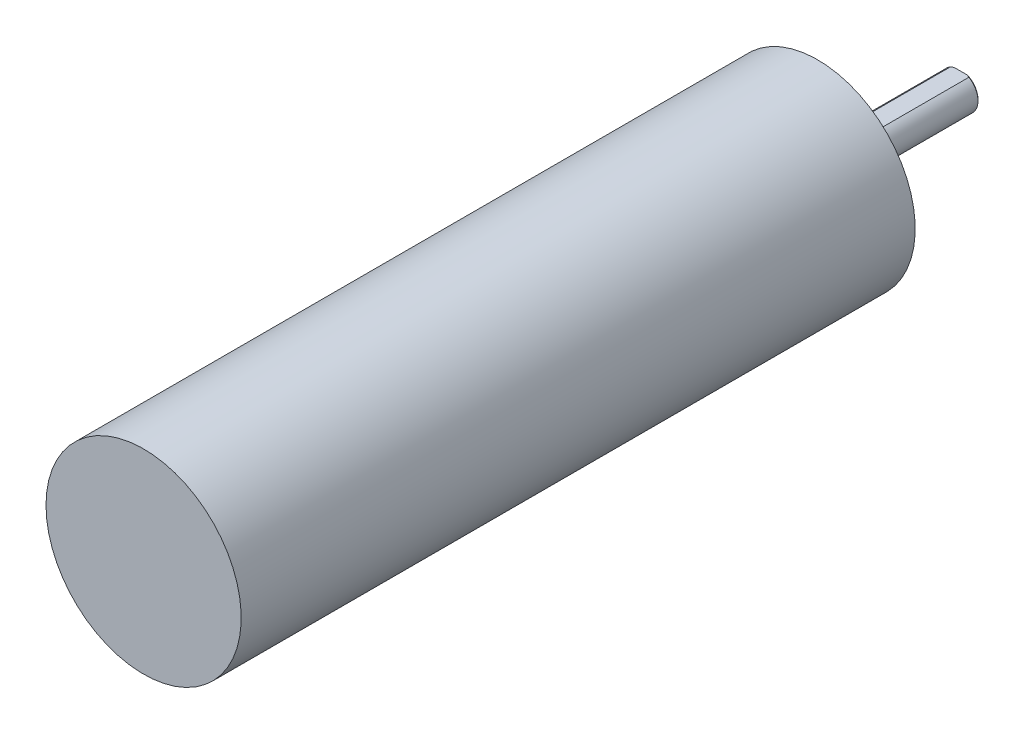
ISO-10303-21;
HEADER;
FILE_DESCRIPTION(('STEP AP214'),'2;1');
FILE_NAME('part.step','',(''),(''),'','','');
FILE_SCHEMA(('AUTOMOTIVE_DESIGN { 1 0 10303 214 1 1 1 1 }'));
ENDSEC;
DATA;
#1=APPLICATION_CONTEXT('core data for automotive mechanical design processes');
#2=APPLICATION_PROTOCOL_DEFINITION('international standard','automotive_design',2000,#1);
#3=PRODUCT_CONTEXT('',#1,'mechanical');
#4=PRODUCT('Part','Part','',(#3));
#5=PRODUCT_RELATED_PRODUCT_CATEGORY('part','',(#4));
#6=PRODUCT_DEFINITION_FORMATION('','',#4);
#7=PRODUCT_DEFINITION_CONTEXT('part definition',#1,'design');
#8=PRODUCT_DEFINITION('design','',#6,#7);
#9=PRODUCT_DEFINITION_SHAPE('','',#8);
#10=(LENGTH_UNIT() NAMED_UNIT(*) SI_UNIT(.MILLI.,.METRE.));
#11=(NAMED_UNIT(*) PLANE_ANGLE_UNIT() SI_UNIT($,.RADIAN.));
#12=(NAMED_UNIT(*) SI_UNIT($,.STERADIAN.) SOLID_ANGLE_UNIT());
#13=UNCERTAINTY_MEASURE_WITH_UNIT(LENGTH_MEASURE(1.E-05),#10,'distance_accuracy_value','');
#14=(GEOMETRIC_REPRESENTATION_CONTEXT(3) GLOBAL_UNCERTAINTY_ASSIGNED_CONTEXT((#13)) GLOBAL_UNIT_ASSIGNED_CONTEXT((#10,
#11,#12)) REPRESENTATION_CONTEXT('',''));
#15=CARTESIAN_POINT('',(0.,0.,0.));
#16=DIRECTION('',(0.,0.,1.));
#17=DIRECTION('',(1.,0.,0.));
#18=AXIS2_PLACEMENT_3D('',#15,#16,#17);
#19=CARTESIAN_POINT('',(0.,0.,-2.6));
#20=DIRECTION('',(0.,0.,-1.));
#21=DIRECTION('',(-1.,0.,0.));
#22=AXIS2_PLACEMENT_3D('',#19,#20,#21);
#23=PLANE('',#22);
#24=CARTESIAN_POINT('',(0.,0.,-2.6));
#25=DIRECTION('',(0.,0.,-1.));
#26=DIRECTION('',(-1.,0.,0.));
#27=AXIS2_PLACEMENT_3D('',#24,#25,#26);
#28=CIRCLE('',#27,2.75);
#29=CARTESIAN_POINT('',(-2.75,0.,-2.6));
#30=VERTEX_POINT('',#29);
#31=EDGE_CURVE('E110',#30,#30,#28,.T.);
#32=ORIENTED_EDGE('',*,*,#31,.T.);
#33=EDGE_LOOP('',(#32));
#34=FACE_BOUND('',#33,.T.);
#35=CARTESIAN_POINT('',(0.,0.,-2.6));
#36=DIRECTION('',(0.,0.,-1.));
#37=DIRECTION('',(-1.,0.,0.));
#38=AXIS2_PLACEMENT_3D('',#35,#36,#37);
#39=CIRCLE('',#38,1.5);
#40=CARTESIAN_POINT('',(-1.5,0.,-2.6));
#41=VERTEX_POINT('',#40);
#42=EDGE_CURVE('E88',#41,#41,#39,.T.);
#43=ORIENTED_EDGE('',*,*,#42,.F.);
#44=EDGE_LOOP('',(#43));
#45=FACE_BOUND('',#44,.T.);
#46=ADVANCED_FACE('F38',(#34,#45),#23,.T.);
#47=CARTESIAN_POINT('',(0.,0.,-1.));
#48=DIRECTION('',(0.,0.,-1.));
#49=DIRECTION('',(-1.,0.,0.));
#50=AXIS2_PLACEMENT_3D('',#47,#48,#49);
#51=PLANE('',#50);
#52=CARTESIAN_POINT('',(0.,0.,-1.));
#53=DIRECTION('',(0.,0.,-1.));
#54=DIRECTION('',(-1.,0.,0.));
#55=AXIS2_PLACEMENT_3D('',#52,#53,#54);
#56=CIRCLE('',#55,3.);
#57=CARTESIAN_POINT('',(-3.,0.,-1.));
#58=VERTEX_POINT('',#57);
#59=EDGE_CURVE('E113',#58,#58,#56,.T.);
#60=ORIENTED_EDGE('',*,*,#59,.T.);
#61=EDGE_LOOP('',(#60));
#62=FACE_BOUND('',#61,.T.);
#63=CARTESIAN_POINT('',(0.,0.,-1.));
#64=DIRECTION('',(0.,0.,-1.));
#65=DIRECTION('',(-1.,0.,0.));
#66=AXIS2_PLACEMENT_3D('',#63,#64,#65);
#67=CIRCLE('',#66,2.75);
#68=CARTESIAN_POINT('',(-2.75,0.,-1.));
#69=VERTEX_POINT('',#68);
#70=EDGE_CURVE('E114',#69,#69,#67,.T.);
#71=ORIENTED_EDGE('',*,*,#70,.F.);
#72=EDGE_LOOP('',(#71));
#73=FACE_BOUND('',#72,.T.);
#74=ADVANCED_FACE('F167',(#62,#73),#51,.T.);
#75=CARTESIAN_POINT('',(0.,0.,-1.));
#76=DIRECTION('',(0.,0.,1.));
#77=DIRECTION('',(1.,0.,0.));
#78=AXIS2_PLACEMENT_3D('',#75,#76,#77);
#79=CYLINDRICAL_SURFACE('',#78,3.);
#80=CARTESIAN_POINT('',(0.,0.,-0.05));
#81=DIRECTION('',(0.,0.,-1.));
#82=DIRECTION('',(-1.,0.,0.));
#83=AXIS2_PLACEMENT_3D('',#80,#81,#82);
#84=CIRCLE('',#83,3.);
#85=CARTESIAN_POINT('',(-3.,0.,-0.05));
#86=VERTEX_POINT('',#85);
#87=EDGE_CURVE('E109',#86,#86,#84,.T.);
#88=ORIENTED_EDGE('',*,*,#87,.T.);
#89=EDGE_LOOP('',(#88));
#90=FACE_BOUND('',#89,.T.);
#91=ORIENTED_EDGE('',*,*,#59,.F.);
#92=EDGE_LOOP('',(#91));
#93=FACE_BOUND('',#92,.T.);
#94=ADVANCED_FACE('F173',(#90,#93),#79,.T.);
#95=CARTESIAN_POINT('',(0.,0.,-2.6));
#96=DIRECTION('',(0.,0.,1.));
#97=DIRECTION('',(1.,0.,0.));
#98=AXIS2_PLACEMENT_3D('',#95,#96,#97);
#99=CYLINDRICAL_SURFACE('',#98,2.75);
#100=ORIENTED_EDGE('',*,*,#31,.F.);
#101=EDGE_LOOP('',(#100));
#102=FACE_BOUND('',#101,.T.);
#103=ORIENTED_EDGE('',*,*,#70,.T.);
#104=EDGE_LOOP('',(#103));
#105=FACE_BOUND('',#104,.T.);
#106=ADVANCED_FACE('F179',(#102,#105),#99,.T.);
#107=CARTESIAN_POINT('',(0.,0.,-11.8));
#108=DIRECTION('',(0.,0.,-1.));
#109=DIRECTION('',(-1.,0.,0.));
#110=AXIS2_PLACEMENT_3D('',#107,#108,#109);
#111=PLANE('',#110);
#112=DIRECTION('',(1.,0.,0.));
#113=VECTOR('',#112,1.);
#114=CARTESIAN_POINT('',(0.748331477354788,1.3,-11.8));
#115=LINE('',#114,#113);
#116=CARTESIAN_POINT('',(-0.519615242270696,1.3,-11.8));
#117=VERTEX_POINT('',#116);
#118=CARTESIAN_POINT('',(0.519615242270697,1.3,-11.8));
#119=VERTEX_POINT('',#118);
#120=EDGE_CURVE('E119',#117,#119,#115,.T.);
#121=ORIENTED_EDGE('',*,*,#120,.T.);
#122=CARTESIAN_POINT('',(0.,0.,-11.8));
#123=DIRECTION('',(0.,0.,-1.));
#124=DIRECTION('',(-1.,0.,0.));
#125=AXIS2_PLACEMENT_3D('',#122,#123,#124);
#126=CIRCLE('',#125,1.40000000000001);
#127=EDGE_CURVE('E87',#119,#117,#126,.T.);
#128=ORIENTED_EDGE('',*,*,#127,.T.);
#129=EDGE_LOOP('',(#121,#128));
#130=FACE_BOUND('',#129,.T.);
#131=ADVANCED_FACE('F146',(#130),#111,.T.);
#132=CARTESIAN_POINT('',(0.,0.,-11.8));
#133=DIRECTION('',(0.,0.,1.));
#134=DIRECTION('',(1.,0.,0.));
#135=AXIS2_PLACEMENT_3D('',#132,#133,#134);
#136=CYLINDRICAL_SURFACE('',#135,1.5);
#137=DIRECTION('',(0.,0.,1.));
#138=VECTOR('',#137,1.);
#139=CARTESIAN_POINT('',(-0.748331477354788,1.3,-11.8));
#140=LINE('',#139,#138);
#141=CARTESIAN_POINT('',(-0.748331477354788,1.3,-11.7));
#142=VERTEX_POINT('',#141);
#143=CARTESIAN_POINT('',(-0.748331477354789,1.3,-4.));
#144=VERTEX_POINT('',#143);
#145=EDGE_CURVE('E75',#142,#144,#140,.T.);
#146=ORIENTED_EDGE('',*,*,#145,.F.);
#147=CARTESIAN_POINT('',(0.,0.,-11.7));
#148=DIRECTION('',(0.,0.,-1.));
#149=DIRECTION('',(-1.,0.,0.));
#150=AXIS2_PLACEMENT_3D('',#147,#148,#149);
#151=CIRCLE('',#150,1.5);
#152=CARTESIAN_POINT('',(0.748331477354788,1.3,-11.7));
#153=VERTEX_POINT('',#152);
#154=EDGE_CURVE('E11',#142,#153,#151,.F.);
#155=ORIENTED_EDGE('',*,*,#154,.T.);
#156=DIRECTION('',(0.,0.,1.));
#157=VECTOR('',#156,1.);
#158=CARTESIAN_POINT('',(0.748331477354788,1.3,-11.8));
#159=LINE('',#158,#157);
#160=CARTESIAN_POINT('',(0.748331477354788,1.3,-4.));
#161=VERTEX_POINT('',#160);
#162=EDGE_CURVE('E81',#153,#161,#159,.T.);
#163=ORIENTED_EDGE('',*,*,#162,.T.);
#164=CARTESIAN_POINT('',(0.,0.,-4.));
#165=DIRECTION('',(0.,0.,-1.));
#166=DIRECTION('',(-1.,0.,0.));
#167=AXIS2_PLACEMENT_3D('',#164,#165,#166);
#168=CIRCLE('',#167,1.5);
#169=EDGE_CURVE('E86',#144,#161,#168,.T.);
#170=ORIENTED_EDGE('',*,*,#169,.F.);
#171=EDGE_LOOP('',(#146,#155,#163,#170));
#172=FACE_BOUND('',#171,.T.);
#173=ORIENTED_EDGE('',*,*,#42,.T.);
#174=EDGE_LOOP('',(#173));
#175=FACE_BOUND('',#174,.T.);
#176=ADVANCED_FACE('F90',(#172,#175),#136,.T.);
#177=CARTESIAN_POINT('',(0.748331477354788,1.3,-11.8));
#178=DIRECTION('',(0.,-1.,0.));
#179=DIRECTION('',(0.,0.,-1.));
#180=AXIS2_PLACEMENT_3D('',#177,#178,#179);
#181=PLANE('',#180);
#182=ORIENTED_EDGE('',*,*,#120,.F.);
#183=CARTESIAN_POINT('',(-0.519615242270697,1.3,-11.8));
#184=CARTESIAN_POINT('',(-0.539135120234035,1.3,-11.7927547242475));
#185=CARTESIAN_POINT('',(-0.558538916494121,1.3,-11.7852013244943));
#186=CARTESIAN_POINT('',(-0.597104377344718,1.3,-11.7695374537162));
#187=CARTESIAN_POINT('',(-0.616266205801922,1.3,-11.7614273866137));
#188=CARTESIAN_POINT('',(-0.654364246463544,1.3,-11.7446994741088));
#189=CARTESIAN_POINT('',(-0.67330047677134,1.3,-11.736081669785));
#190=CARTESIAN_POINT('',(-0.710969948637626,1.3,-11.7183785480483));
#191=CARTESIAN_POINT('',(-0.729703034579311,1.3,-11.7092928991887));
#192=CARTESIAN_POINT('',(-0.748331477354788,1.3,-11.7));
#193=B_SPLINE_CURVE_WITH_KNOTS('',3,(#183,#184,#185,#186,#187,#188,#189,#190,#191,#192),
.UNSPECIFIED.,.F.,.F.,(4,2,2,2,4),(0.,0.0624584960327279,0.124872141246711,0.187280743806981,
0.249734185241813),.UNSPECIFIED.);
#194=EDGE_CURVE('E47',#117,#142,#193,.T.);
#195=ORIENTED_EDGE('',*,*,#194,.T.);
#196=ORIENTED_EDGE('',*,*,#145,.T.);
#197=DIRECTION('',(1.,0.,0.));
#198=VECTOR('',#197,1.);
#199=CARTESIAN_POINT('',(0.748331477354788,1.3,-4.));
#200=LINE('',#199,#198);
#201=EDGE_CURVE('E78',#144,#161,#200,.T.);
#202=ORIENTED_EDGE('',*,*,#201,.T.);
#203=ORIENTED_EDGE('',*,*,#162,.F.);
#204=CARTESIAN_POINT('',(0.748331477354788,1.3,-11.7));
#205=CARTESIAN_POINT('',(0.729703034579311,1.3,-11.7092928991887));
#206=CARTESIAN_POINT('',(0.710969948637627,1.3,-11.7183785480483));
#207=CARTESIAN_POINT('',(0.673300476771341,1.3,-11.736081669785));
#208=CARTESIAN_POINT('',(0.654364246463545,1.3,-11.7446994741088));
#209=CARTESIAN_POINT('',(0.616266205801922,1.3,-11.7614273866137));
#210=CARTESIAN_POINT('',(0.597104377344718,1.3,-11.7695374537162));
#211=CARTESIAN_POINT('',(0.558538916494121,1.3,-11.7852013244943));
#212=CARTESIAN_POINT('',(0.539135120234035,1.3,-11.7927547242475));
#213=CARTESIAN_POINT('',(0.519615242270697,1.3,-11.8));
#214=B_SPLINE_CURVE_WITH_KNOTS('',3,(#204,#205,#206,#207,#208,#209,#210,#211,#212,#213),
.UNSPECIFIED.,.F.,.F.,(4,2,2,2,4),(0.,0.0624534414348304,0.124862043995102,0.187275689209085,
0.249734185241813),.UNSPECIFIED.);
#215=EDGE_CURVE('E131',#153,#119,#214,.T.);
#216=ORIENTED_EDGE('',*,*,#215,.T.);
#217=EDGE_LOOP('',(#182,#195,#196,#202,#203,#216));
#218=FACE_BOUND('',#217,.T.);
#219=ADVANCED_FACE('F77',(#218),#181,.F.);
#220=CARTESIAN_POINT('',(0.,0.,-0.05));
#221=DIRECTION('',(0.,0.,-1.));
#222=DIRECTION('',(-1.,0.,0.));
#223=AXIS2_PLACEMENT_3D('',#220,#221,#222);
#224=PLANE('',#223);
#225=CARTESIAN_POINT('',(5.5,0.,-0.0500000000000001));
#226=DIRECTION('',(0.,0.,-1.));
#227=DIRECTION('',(-1.,0.,0.));
#228=AXIS2_PLACEMENT_3D('',#225,#226,#227);
#229=CIRCLE('',#228,0.799999999999999);
#230=CARTESIAN_POINT('',(4.7,0.,-0.0500000000000001));
#231=VERTEX_POINT('',#230);
#232=EDGE_CURVE('E92',#231,#231,#229,.T.);
#233=ORIENTED_EDGE('',*,*,#232,.F.);
#234=EDGE_LOOP('',(#233));
#235=FACE_BOUND('',#234,.T.);
#236=CARTESIAN_POINT('',(-5.5,0.,-0.0500000000000001));
#237=DIRECTION('',(0.,0.,-1.));
#238=DIRECTION('',(-1.,0.,0.));
#239=AXIS2_PLACEMENT_3D('',#236,#237,#238);
#240=CIRCLE('',#239,0.799999999999999);
#241=CARTESIAN_POINT('',(-6.3,0.,-0.0500000000000001));
#242=VERTEX_POINT('',#241);
#243=EDGE_CURVE('E100',#242,#242,#240,.T.);
#244=ORIENTED_EDGE('',*,*,#243,.F.);
#245=EDGE_LOOP('',(#244));
#246=FACE_BOUND('',#245,.T.);
#247=CARTESIAN_POINT('',(0.,0.,-0.05));
#248=DIRECTION('',(0.,0.,-1.));
#249=DIRECTION('',(-1.,0.,0.));
#250=AXIS2_PLACEMENT_3D('',#247,#248,#249);
#251=CIRCLE('',#250,8.);
#252=CARTESIAN_POINT('',(-8.,0.,-0.0499999999999945));
#253=VERTEX_POINT('',#252);
#254=EDGE_CURVE('E106',#253,#253,#251,.T.);
#255=ORIENTED_EDGE('',*,*,#254,.T.);
#256=EDGE_LOOP('',(#255));
#257=FACE_BOUND('',#256,.T.);
#258=ORIENTED_EDGE('',*,*,#87,.F.);
#259=EDGE_LOOP('',(#258));
#260=FACE_BOUND('',#259,.T.);
#261=ADVANCED_FACE('F145',(#235,#246,#257,#260),#224,.T.);
#262=CARTESIAN_POINT('',(0.,0.,55.2));
#263=DIRECTION('',(0.,0.,1.));
#264=DIRECTION('',(1.,0.,0.));
#265=AXIS2_PLACEMENT_3D('',#262,#263,#264);
#266=PLANE('',#265);
#267=CARTESIAN_POINT('',(0.,0.,55.2));
#268=DIRECTION('',(0.,0.,1.));
#269=DIRECTION('',(1.,0.,0.));
#270=AXIS2_PLACEMENT_3D('',#267,#268,#269);
#271=CIRCLE('',#270,8.);
#272=CARTESIAN_POINT('',(-8.,0.,55.2));
#273=VERTEX_POINT('',#272);
#274=EDGE_CURVE('E80',#273,#273,#271,.T.);
#275=ORIENTED_EDGE('',*,*,#274,.T.);
#276=EDGE_LOOP('',(#275));
#277=FACE_BOUND('',#276,.T.);
#278=ADVANCED_FACE('F151',(#277),#266,.T.);
#279=CARTESIAN_POINT('',(0.,0.,55.2));
#280=DIRECTION('',(0.,0.,-1.));
#281=DIRECTION('',(-1.,0.,0.));
#282=AXIS2_PLACEMENT_3D('',#279,#280,#281);
#283=CYLINDRICAL_SURFACE('',#282,8.);
#284=CARTESIAN_POINT('',(-8.,0.,55.2));
#285=CARTESIAN_POINT('',(-8.,0.,54.6244791666667));
#286=CARTESIAN_POINT('',(-8.,0.,54.0489583333333));
#287=CARTESIAN_POINT('',(-8.,0.,52.8979166666667));
#288=CARTESIAN_POINT('',(-8.,0.,52.3223958333333));
#289=CARTESIAN_POINT('',(-8.,0.,51.1713541666667));
#290=CARTESIAN_POINT('',(-8.,0.,50.5958333333333));
#291=CARTESIAN_POINT('',(-8.,0.,49.4447916666667));
#292=CARTESIAN_POINT('',(-8.,0.,48.8692708333333));
#293=CARTESIAN_POINT('',(-8.,0.,47.7182291666667));
#294=CARTESIAN_POINT('',(-8.,0.,47.1427083333333));
#295=CARTESIAN_POINT('',(-8.,0.,45.9916666666667));
#296=CARTESIAN_POINT('',(-8.,0.,45.4161458333333));
#297=CARTESIAN_POINT('',(-8.,0.,44.2651041666667));
#298=CARTESIAN_POINT('',(-8.,0.,43.6895833333333));
#299=CARTESIAN_POINT('',(-8.,0.,42.5385416666667));
#300=CARTESIAN_POINT('',(-8.,0.,41.9630208333333));
#301=CARTESIAN_POINT('',(-8.,0.,40.8119791666667));
#302=CARTESIAN_POINT('',(-8.,0.,40.2364583333333));
#303=CARTESIAN_POINT('',(-8.,0.,39.0854166666667));
#304=CARTESIAN_POINT('',(-8.,0.,38.5098958333333));
#305=CARTESIAN_POINT('',(-8.,0.,37.3588541666667));
#306=CARTESIAN_POINT('',(-8.,0.,36.7833333333333));
#307=CARTESIAN_POINT('',(-8.,0.,35.6322916666667));
#308=CARTESIAN_POINT('',(-8.,0.,35.0567708333333));
#309=CARTESIAN_POINT('',(-8.,0.,33.9057291666667));
#310=CARTESIAN_POINT('',(-8.,0.,33.3302083333333));
#311=CARTESIAN_POINT('',(-8.,0.,32.1791666666667));
#312=CARTESIAN_POINT('',(-8.,0.,31.6036458333333));
#313=CARTESIAN_POINT('',(-8.,0.,30.4526041666667));
#314=CARTESIAN_POINT('',(-8.,0.,29.8770833333333));
#315=CARTESIAN_POINT('',(-8.,0.,28.7260416666667));
#316=CARTESIAN_POINT('',(-8.,0.,28.1505208333333));
#317=CARTESIAN_POINT('',(-8.,0.,26.9994791666667));
#318=CARTESIAN_POINT('',(-8.,0.,26.4239583333333));
#319=CARTESIAN_POINT('',(-8.,0.,25.2729166666667));
#320=CARTESIAN_POINT('',(-8.,0.,24.6973958333333));
#321=CARTESIAN_POINT('',(-8.,0.,23.5463541666667));
#322=CARTESIAN_POINT('',(-8.,0.,22.9708333333333));
#323=CARTESIAN_POINT('',(-8.,0.,21.8197916666667));
#324=CARTESIAN_POINT('',(-8.,0.,21.2442708333333));
#325=CARTESIAN_POINT('',(-8.,0.,20.0932291666667));
#326=CARTESIAN_POINT('',(-8.,0.,19.5177083333333));
#327=CARTESIAN_POINT('',(-8.,0.,18.3666666666667));
#328=CARTESIAN_POINT('',(-8.,0.,17.7911458333333));
#329=CARTESIAN_POINT('',(-8.,0.,16.6401041666667));
#330=CARTESIAN_POINT('',(-8.,0.,16.0645833333333));
#331=CARTESIAN_POINT('',(-8.,0.,14.9135416666667));
#332=CARTESIAN_POINT('',(-8.,0.,14.3380208333333));
#333=CARTESIAN_POINT('',(-8.,0.,13.1869791666667));
#334=CARTESIAN_POINT('',(-8.,0.,12.6114583333333));
#335=CARTESIAN_POINT('',(-8.,0.,11.4604166666667));
#336=CARTESIAN_POINT('',(-8.,0.,10.8848958333333));
#337=CARTESIAN_POINT('',(-8.,0.,9.73385416666667));
#338=CARTESIAN_POINT('',(-8.,0.,9.15833333333334));
#339=CARTESIAN_POINT('',(-8.,0.,8.00729166666667));
#340=CARTESIAN_POINT('',(-8.,0.,7.43177083333334));
#341=CARTESIAN_POINT('',(-8.,0.,6.28072916666667));
#342=CARTESIAN_POINT('',(-8.,0.,5.70520833333334));
#343=CARTESIAN_POINT('',(-8.,0.,4.55416666666667));
#344=CARTESIAN_POINT('',(-8.,0.,3.97864583333334));
#345=CARTESIAN_POINT('',(-8.,0.,2.82760416666667));
#346=CARTESIAN_POINT('',(-8.,0.,2.25208333333334));
#347=CARTESIAN_POINT('',(-8.,0.,1.10104166666667));
#348=CARTESIAN_POINT('',(-8.,0.,0.52552083333334));
#349=CARTESIAN_POINT('',(-8.,0.,-0.0499999999999945));
#350=B_SPLINE_CURVE_WITH_KNOTS('',3,(#284,#285,#286,#287,#288,#289,#290,#291,#292,#293,#294,
#295,#296,#297,#298,#299,#300,#301,#302,#303,#304,#305,#306,#307,#308,#309,#310,#311,#312,#313,
#314,#315,#316,#317,#318,#319,#320,#321,#322,#323,#324,#325,#326,#327,#328,#329,#330,#331,#332,
#333,#334,#335,#336,#337,#338,#339,#340,#341,#342,#343,#344,#345,#346,#347,#348,#349),
.UNSPECIFIED.,.F.,.F.,(4,2,2,2,2,2,2,2,2,2,2,2,2,2,2,2,2,2,2,2,2,2,2,2,2,2,2,2,2,2,2,2,4),(0.,
1.72656249999999,3.45312499999999,5.17968749999999,6.90625,8.6328125,10.359375,12.0859375,
13.8125,15.5390625,17.265625,18.9921875,20.71875,22.4453125,24.171875,25.8984375,27.625,
29.3515625,31.078125,32.8046875,34.53125,36.2578125,37.984375,39.7109375,41.4375,43.1640625,
44.890625,46.6171875,48.34375,50.0703125,51.796875,53.5234375,55.25),.UNSPECIFIED.);
#351=EDGE_CURVE('BSEAM153',#273,#253,#350,.T.);
#352=ORIENTED_EDGE('',*,*,#274,.F.);
#353=ORIENTED_EDGE('',*,*,#254,.F.);
#354=ORIENTED_EDGE('',*,*,#351,.T.);
#355=ORIENTED_EDGE('',*,*,#351,.F.);
#356=EDGE_LOOP('',(#352,#354,#353,#355));
#357=FACE_BOUND('',#356,.T.);
#358=ADVANCED_FACE('F153',(#357),#283,.T.);
#359=CARTESIAN_POINT('',(-5.5,0.,5.15));
#360=DIRECTION('',(0.,0.,-1.));
#361=DIRECTION('',(-1.,0.,0.));
#362=AXIS2_PLACEMENT_3D('',#359,#360,#361);
#363=CONICAL_SURFACE('',#362,0.799999999999999,1.02974425867665);
#364=CARTESIAN_POINT('',(-5.5,0.,5.63068849522205));
#365=VERTEX_POINT('',#364);
#366=VERTEX_LOOP('',#365);
#367=FACE_BOUND('',#366,.T.);
#368=CARTESIAN_POINT('',(-5.5,0.,5.15));
#369=DIRECTION('',(0.,0.,-1.));
#370=DIRECTION('',(-1.,0.,0.));
#371=AXIS2_PLACEMENT_3D('',#368,#369,#370);
#372=CIRCLE('',#371,0.799999999999999);
#373=CARTESIAN_POINT('',(-6.3,0.,5.15));
#374=VERTEX_POINT('',#373);
#375=EDGE_CURVE('E103',#374,#374,#372,.T.);
#376=ORIENTED_EDGE('',*,*,#375,.T.);
#377=EDGE_LOOP('',(#376));
#378=FACE_BOUND('',#377,.T.);
#379=ADVANCED_FACE('F156',(#367,#378),#363,.F.);
#380=CARTESIAN_POINT('',(-5.5,0.,-0.05));
#381=DIRECTION('',(0.,0.,-1.));
#382=DIRECTION('',(-1.,0.,0.));
#383=AXIS2_PLACEMENT_3D('',#380,#381,#382);
#384=CYLINDRICAL_SURFACE('',#383,0.799999999999999);
#385=ORIENTED_EDGE('',*,*,#375,.F.);
#386=EDGE_LOOP('',(#385));
#387=FACE_BOUND('',#386,.T.);
#388=ORIENTED_EDGE('',*,*,#243,.T.);
#389=EDGE_LOOP('',(#388));
#390=FACE_BOUND('',#389,.T.);
#391=ADVANCED_FACE('F161',(#387,#390),#384,.F.);
#392=CARTESIAN_POINT('',(5.5,0.,5.15));
#393=DIRECTION('',(0.,0.,-1.));
#394=DIRECTION('',(-1.,0.,0.));
#395=AXIS2_PLACEMENT_3D('',#392,#393,#394);
#396=CONICAL_SURFACE('',#395,0.799999999999999,1.02974425867665);
#397=CARTESIAN_POINT('',(5.5,0.,5.63068849522205));
#398=VERTEX_POINT('',#397);
#399=VERTEX_LOOP('',#398);
#400=FACE_BOUND('',#399,.T.);
#401=CARTESIAN_POINT('',(5.5,0.,5.15));
#402=DIRECTION('',(0.,0.,-1.));
#403=DIRECTION('',(-1.,0.,0.));
#404=AXIS2_PLACEMENT_3D('',#401,#402,#403);
#405=CIRCLE('',#404,0.799999999999999);
#406=CARTESIAN_POINT('',(4.7,0.,5.15));
#407=VERTEX_POINT('',#406);
#408=EDGE_CURVE('E95',#407,#407,#405,.T.);
#409=ORIENTED_EDGE('',*,*,#408,.T.);
#410=EDGE_LOOP('',(#409));
#411=FACE_BOUND('',#410,.T.);
#412=ADVANCED_FACE('F204',(#400,#411),#396,.F.);
#413=CARTESIAN_POINT('',(5.5,0.,-0.05));
#414=DIRECTION('',(0.,0.,-1.));
#415=DIRECTION('',(-1.,0.,0.));
#416=AXIS2_PLACEMENT_3D('',#413,#414,#415);
#417=CYLINDRICAL_SURFACE('',#416,0.799999999999999);
#418=ORIENTED_EDGE('',*,*,#408,.F.);
#419=EDGE_LOOP('',(#418));
#420=FACE_BOUND('',#419,.T.);
#421=ORIENTED_EDGE('',*,*,#232,.T.);
#422=EDGE_LOOP('',(#421));
#423=FACE_BOUND('',#422,.T.);
#424=ADVANCED_FACE('F210',(#420,#423),#417,.F.);
#425=CARTESIAN_POINT('',(0.,0.,-4.));
#426=DIRECTION('',(0.,0.,-1.));
#427=DIRECTION('',(-1.,0.,0.));
#428=AXIS2_PLACEMENT_3D('',#425,#426,#427);
#429=PLANE('',#428);
#430=ORIENTED_EDGE('',*,*,#201,.F.);
#431=ORIENTED_EDGE('',*,*,#169,.T.);
#432=EDGE_LOOP('',(#430,#431));
#433=FACE_BOUND('',#432,.T.);
#434=ADVANCED_FACE('F85',(#433),#429,.T.);
#435=CARTESIAN_POINT('',(0.,0.,-11.8));
#436=DIRECTION('',(0.,0.,1.));
#437=DIRECTION('',(1.,0.,0.));
#438=AXIS2_PLACEMENT_3D('',#435,#436,#437);
#439=CONICAL_SURFACE('',#438,1.40000000000001,0.785398163397443);
#440=ORIENTED_EDGE('',*,*,#215,.F.);
#441=ORIENTED_EDGE('',*,*,#154,.F.);
#442=ORIENTED_EDGE('',*,*,#194,.F.);
#443=ORIENTED_EDGE('',*,*,#127,.F.);
#444=EDGE_LOOP('',(#440,#441,#442,#443));
#445=FACE_BOUND('',#444,.T.);
#446=ADVANCED_FACE('F40',(#445),#439,.T.);
#447=CLOSED_SHELL('',(#46,#74,#94,#106,#131,#176,#219,#261,#278,#358,#379,#391,#412,#424,#434,#446));
#448=MANIFOLD_SOLID_BREP('B2',#447);
#449=ADVANCED_BREP_SHAPE_REPRESENTATION('',(#18,#448),#14);
#450=SHAPE_DEFINITION_REPRESENTATION(#9,#449);
ENDSEC;
END-ISO-10303-21;
